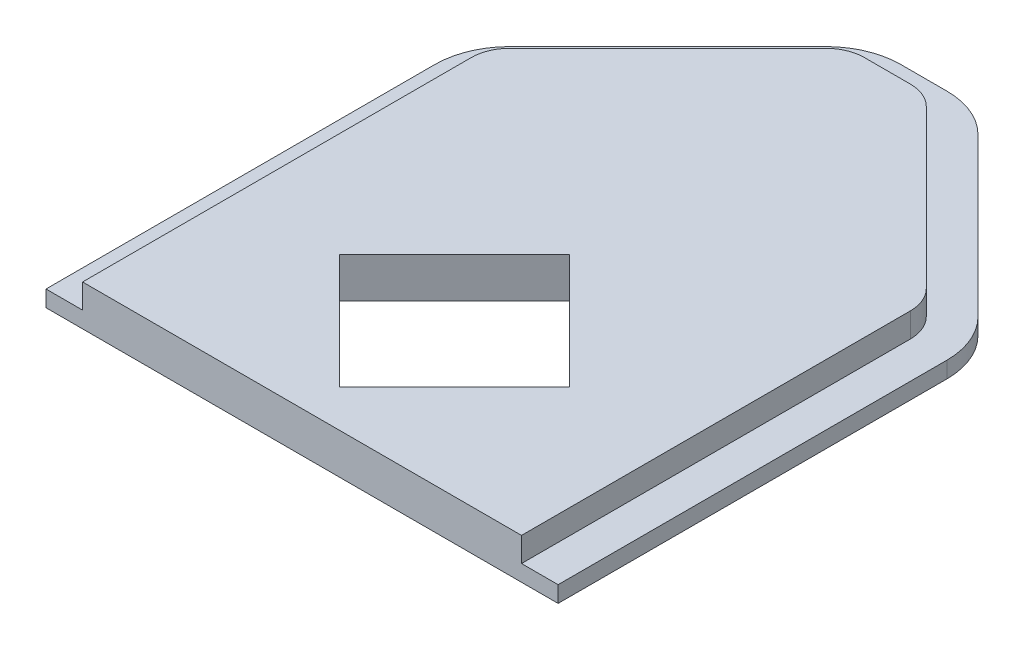
ISO-10303-21;
HEADER;
FILE_DESCRIPTION(('STEP AP214'),'2;1');
FILE_NAME('part.step','',(''),(''),'','','');
FILE_SCHEMA(('AUTOMOTIVE_DESIGN { 1 0 10303 214 1 1 1 1 }'));
ENDSEC;
DATA;
#1=APPLICATION_CONTEXT('core data for automotive mechanical design processes');
#2=APPLICATION_PROTOCOL_DEFINITION('international standard','automotive_design',2000,#1);
#3=PRODUCT_CONTEXT('',#1,'mechanical');
#4=PRODUCT('Part','Part','',(#3));
#5=PRODUCT_RELATED_PRODUCT_CATEGORY('part','',(#4));
#6=PRODUCT_DEFINITION_FORMATION('','',#4);
#7=PRODUCT_DEFINITION_CONTEXT('part definition',#1,'design');
#8=PRODUCT_DEFINITION('design','',#6,#7);
#9=PRODUCT_DEFINITION_SHAPE('','',#8);
#10=(LENGTH_UNIT() NAMED_UNIT(*) SI_UNIT(.MILLI.,.METRE.));
#11=(NAMED_UNIT(*) PLANE_ANGLE_UNIT() SI_UNIT($,.RADIAN.));
#12=(NAMED_UNIT(*) SI_UNIT($,.STERADIAN.) SOLID_ANGLE_UNIT());
#13=UNCERTAINTY_MEASURE_WITH_UNIT(LENGTH_MEASURE(1.E-05),#10,'distance_accuracy_value','');
#14=(GEOMETRIC_REPRESENTATION_CONTEXT(3) GLOBAL_UNCERTAINTY_ASSIGNED_CONTEXT((#13)) GLOBAL_UNIT_ASSIGNED_CONTEXT((#10,
#11,#12)) REPRESENTATION_CONTEXT('',''));
#15=CARTESIAN_POINT('',(0.,0.,0.));
#16=DIRECTION('',(0.,0.,1.));
#17=DIRECTION('',(1.,0.,0.));
#18=AXIS2_PLACEMENT_3D('',#15,#16,#17);
#19=CARTESIAN_POINT('',(10.8,2.,0.));
#20=DIRECTION('',(-1.,0.,0.));
#21=DIRECTION('',(0.,0.,1.));
#22=AXIS2_PLACEMENT_3D('',#19,#20,#21);
#23=PLANE('',#22);
#24=DIRECTION('',(0.,0.,1.));
#25=VECTOR('',#24,1.);
#26=CARTESIAN_POINT('',(10.8,0.8,0.));
#27=LINE('',#26,#25);
#28=CARTESIAN_POINT('',(10.8,0.8,-19.1301515190165));
#29=VERTEX_POINT('',#28);
#30=CARTESIAN_POINT('',(10.8,0.8,0.));
#31=VERTEX_POINT('',#30);
#32=EDGE_CURVE('E327',#29,#31,#27,.T.);
#33=ORIENTED_EDGE('',*,*,#32,.F.);
#34=DIRECTION('',(0.,-1.,0.));
#35=VECTOR('',#34,1.);
#36=CARTESIAN_POINT('',(10.8,2.,-19.1301515190165));
#37=LINE('',#36,#35);
#38=CARTESIAN_POINT('',(10.8,2.,-19.1301515190165));
#39=VERTEX_POINT('',#38);
#40=EDGE_CURVE('E359',#29,#39,#37,.F.);
#41=ORIENTED_EDGE('',*,*,#40,.T.);
#42=DIRECTION('',(0.,0.,-1.));
#43=VECTOR('',#42,1.);
#44=CARTESIAN_POINT('',(10.8,2.,0.));
#45=LINE('',#44,#43);
#46=CARTESIAN_POINT('',(10.8,2.,0.));
#47=VERTEX_POINT('',#46);
#48=EDGE_CURVE('E333',#47,#39,#45,.T.);
#49=ORIENTED_EDGE('',*,*,#48,.F.);
#50=DIRECTION('',(0.,-1.,0.));
#51=VECTOR('',#50,1.);
#52=CARTESIAN_POINT('',(10.8,2.,0.));
#53=LINE('',#52,#51);
#54=EDGE_CURVE('E351',#47,#31,#53,.T.);
#55=ORIENTED_EDGE('',*,*,#54,.T.);
#56=EDGE_LOOP('',(#33,#41,#49,#55));
#57=FACE_BOUND('',#56,.T.);
#58=ADVANCED_FACE('F33',(#57),#23,.F.);
#59=CARTESIAN_POINT('',(10.8,2.,-19.9171572875254));
#60=DIRECTION('',(-0.707106781186546,0.,0.707106781186549));
#61=DIRECTION('',(0.707106781186549,0.,0.707106781186546));
#62=AXIS2_PLACEMENT_3D('',#59,#60,#61);
#63=PLANE('',#62);
#64=DIRECTION('',(0.707106781186549,0.,0.707106781186546));
#65=VECTOR('',#64,1.);
#66=CARTESIAN_POINT('',(10.8,0.8,-19.9171572875254));
#67=LINE('',#66,#65);
#68=CARTESIAN_POINT('',(2.47365440327094,0.8,-28.2435028842544));
#69=VERTEX_POINT('',#68);
#70=CARTESIAN_POINT('',(10.2435028842544,0.8,-20.4736544032709));
#71=VERTEX_POINT('',#70);
#72=EDGE_CURVE('E322',#69,#71,#67,.T.);
#73=ORIENTED_EDGE('',*,*,#72,.F.);
#74=DIRECTION('',(0.,-1.,0.));
#75=VECTOR('',#74,1.);
#76=CARTESIAN_POINT('',(2.47365440327094,2.,-28.2435028842544));
#77=LINE('',#76,#75);
#78=CARTESIAN_POINT('',(2.47365440327094,2.,-28.2435028842544));
#79=VERTEX_POINT('',#78);
#80=EDGE_CURVE('E354',#69,#79,#77,.F.);
#81=ORIENTED_EDGE('',*,*,#80,.T.);
#82=DIRECTION('',(-0.707106781186549,0.,-0.707106781186546));
#83=VECTOR('',#82,1.);
#84=CARTESIAN_POINT('',(10.8,2.,-19.9171572875254));
#85=LINE('',#84,#83);
#86=CARTESIAN_POINT('',(10.2435028842544,2.,-20.4736544032709));
#87=VERTEX_POINT('',#86);
#88=EDGE_CURVE('E336',#87,#79,#85,.T.);
#89=ORIENTED_EDGE('',*,*,#88,.F.);
#90=DIRECTION('',(0.,-1.,0.));
#91=VECTOR('',#90,1.);
#92=CARTESIAN_POINT('',(10.2435028842544,2.,-20.4736544032709));
#93=LINE('',#92,#91);
#94=EDGE_CURVE('E356',#87,#71,#93,.T.);
#95=ORIENTED_EDGE('',*,*,#94,.T.);
#96=EDGE_LOOP('',(#73,#81,#89,#95));
#97=FACE_BOUND('',#96,.T.);
#98=ADVANCED_FACE('F410',(#97),#63,.F.);
#99=CARTESIAN_POINT('',(-1.91715728752538,2.,-28.8));
#100=DIRECTION('',(0.,0.,1.));
#101=DIRECTION('',(1.,0.,0.));
#102=AXIS2_PLACEMENT_3D('',#99,#100,#101);
#103=PLANE('',#102);
#104=DIRECTION('',(1.,0.,0.));
#105=VECTOR('',#104,1.);
#106=CARTESIAN_POINT('',(-1.91715728752538,0.8,-28.8));
#107=LINE('',#106,#105);
#108=CARTESIAN_POINT('',(-1.1301515190165,0.8,-28.8));
#109=VERTEX_POINT('',#108);
#110=CARTESIAN_POINT('',(1.1301515190165,0.8,-28.8));
#111=VERTEX_POINT('',#110);
#112=EDGE_CURVE('E317',#109,#111,#107,.T.);
#113=ORIENTED_EDGE('',*,*,#112,.F.);
#114=DIRECTION('',(0.,-1.,0.));
#115=VECTOR('',#114,1.);
#116=CARTESIAN_POINT('',(-1.1301515190165,2.,-28.8));
#117=LINE('',#116,#115);
#118=CARTESIAN_POINT('',(-1.1301515190165,2.,-28.8));
#119=VERTEX_POINT('',#118);
#120=EDGE_CURVE('E369',#109,#119,#117,.F.);
#121=ORIENTED_EDGE('',*,*,#120,.T.);
#122=DIRECTION('',(-1.,0.,0.));
#123=VECTOR('',#122,1.);
#124=CARTESIAN_POINT('',(-1.91715728752538,2.,-28.8));
#125=LINE('',#124,#123);
#126=CARTESIAN_POINT('',(1.1301515190165,2.,-28.8));
#127=VERTEX_POINT('',#126);
#128=EDGE_CURVE('E339',#127,#119,#125,.T.);
#129=ORIENTED_EDGE('',*,*,#128,.F.);
#130=DIRECTION('',(0.,-1.,0.));
#131=VECTOR('',#130,1.);
#132=CARTESIAN_POINT('',(1.1301515190165,2.,-28.8));
#133=LINE('',#132,#131);
#134=EDGE_CURVE('E371',#127,#111,#133,.T.);
#135=ORIENTED_EDGE('',*,*,#134,.T.);
#136=EDGE_LOOP('',(#113,#121,#129,#135));
#137=FACE_BOUND('',#136,.T.);
#138=ADVANCED_FACE('F401',(#137),#103,.F.);
#139=CARTESIAN_POINT('',(-10.8,2.,-19.9171572875254));
#140=DIRECTION('',(0.707106781186546,0.,0.707106781186549));
#141=DIRECTION('',(0.707106781186549,0.,-0.707106781186546));
#142=AXIS2_PLACEMENT_3D('',#139,#140,#141);
#143=PLANE('',#142);
#144=DIRECTION('',(0.707106781186549,0.,-0.707106781186546));
#145=VECTOR('',#144,1.);
#146=CARTESIAN_POINT('',(-10.8,0.8,-19.9171572875254));
#147=LINE('',#146,#145);
#148=CARTESIAN_POINT('',(-10.2435028842544,0.8,-20.4736544032709));
#149=VERTEX_POINT('',#148);
#150=CARTESIAN_POINT('',(-2.47365440327094,0.8,-28.2435028842544));
#151=VERTEX_POINT('',#150);
#152=EDGE_CURVE('E312',#149,#151,#147,.T.);
#153=ORIENTED_EDGE('',*,*,#152,.F.);
#154=DIRECTION('',(0.,-1.,0.));
#155=VECTOR('',#154,1.);
#156=CARTESIAN_POINT('',(-10.2435028842544,2.,-20.4736544032709));
#157=LINE('',#156,#155);
#158=CARTESIAN_POINT('',(-10.2435028842544,2.,-20.4736544032709));
#159=VERTEX_POINT('',#158);
#160=EDGE_CURVE('E374',#149,#159,#157,.F.);
#161=ORIENTED_EDGE('',*,*,#160,.T.);
#162=DIRECTION('',(-0.707106781186549,0.,0.707106781186546));
#163=VECTOR('',#162,1.);
#164=CARTESIAN_POINT('',(-10.8,2.,-19.9171572875254));
#165=LINE('',#164,#163);
#166=CARTESIAN_POINT('',(-2.47365440327094,2.,-28.2435028842544));
#167=VERTEX_POINT('',#166);
#168=EDGE_CURVE('E342',#167,#159,#165,.T.);
#169=ORIENTED_EDGE('',*,*,#168,.F.);
#170=DIRECTION('',(0.,-1.,0.));
#171=VECTOR('',#170,1.);
#172=CARTESIAN_POINT('',(-2.47365440327094,2.,-28.2435028842544));
#173=LINE('',#172,#171);
#174=EDGE_CURVE('E376',#167,#151,#173,.T.);
#175=ORIENTED_EDGE('',*,*,#174,.T.);
#176=EDGE_LOOP('',(#153,#161,#169,#175));
#177=FACE_BOUND('',#176,.T.);
#178=ADVANCED_FACE('F392',(#177),#143,.F.);
#179=CARTESIAN_POINT('',(-10.8,2.,0.));
#180=DIRECTION('',(1.,0.,0.));
#181=DIRECTION('',(0.,0.,-1.));
#182=AXIS2_PLACEMENT_3D('',#179,#180,#181);
#183=PLANE('',#182);
#184=DIRECTION('',(0.,0.,-1.));
#185=VECTOR('',#184,1.);
#186=CARTESIAN_POINT('',(-10.8,0.8,0.));
#187=LINE('',#186,#185);
#188=CARTESIAN_POINT('',(-10.8,0.8,0.));
#189=VERTEX_POINT('',#188);
#190=CARTESIAN_POINT('',(-10.8,0.8,-19.1301515190165));
#191=VERTEX_POINT('',#190);
#192=EDGE_CURVE('E291',#189,#191,#187,.T.);
#193=ORIENTED_EDGE('',*,*,#192,.F.);
#194=DIRECTION('',(0.,-1.,0.));
#195=VECTOR('',#194,1.);
#196=CARTESIAN_POINT('',(-10.8,2.,0.));
#197=LINE('',#196,#195);
#198=CARTESIAN_POINT('',(-10.8,2.,0.));
#199=VERTEX_POINT('',#198);
#200=EDGE_CURVE('E347',#199,#189,#197,.T.);
#201=ORIENTED_EDGE('',*,*,#200,.F.);
#202=DIRECTION('',(0.,0.,1.));
#203=VECTOR('',#202,1.);
#204=CARTESIAN_POINT('',(-10.8,2.,0.));
#205=LINE('',#204,#203);
#206=CARTESIAN_POINT('',(-10.8,2.,-19.1301515190165));
#207=VERTEX_POINT('',#206);
#208=EDGE_CURVE('E345',#207,#199,#205,.T.);
#209=ORIENTED_EDGE('',*,*,#208,.F.);
#210=DIRECTION('',(0.,-1.,0.));
#211=VECTOR('',#210,1.);
#212=CARTESIAN_POINT('',(-10.8,2.,-19.1301515190165));
#213=LINE('',#212,#211);
#214=EDGE_CURVE('E41',#207,#191,#213,.T.);
#215=ORIENTED_EDGE('',*,*,#214,.T.);
#216=EDGE_LOOP('',(#193,#201,#209,#215));
#217=FACE_BOUND('',#216,.T.);
#218=ADVANCED_FACE('F383',(#217),#183,.F.);
#219=CARTESIAN_POINT('',(8.9,2.,-19.1301515190165));
#220=DIRECTION('',(0.,-1.,0.));
#221=DIRECTION('',(0.,0.,-1.));
#222=AXIS2_PLACEMENT_3D('',#219,#220,#221);
#223=CYLINDRICAL_SURFACE('',#222,1.9);
#224=ORIENTED_EDGE('',*,*,#40,.F.);
#225=CARTESIAN_POINT('',(8.9,0.8,-19.1301515190165));
#226=DIRECTION('',(0.,-1.,0.));
#227=DIRECTION('',(0.,0.,-1.));
#228=AXIS2_PLACEMENT_3D('',#225,#226,#227);
#229=CIRCLE('',#228,1.9);
#230=EDGE_CURVE('E324',#29,#71,#229,.F.);
#231=ORIENTED_EDGE('',*,*,#230,.T.);
#232=ORIENTED_EDGE('',*,*,#94,.F.);
#233=CARTESIAN_POINT('',(8.9,2.,-19.1301515190165));
#234=DIRECTION('',(0.,1.,0.));
#235=DIRECTION('',(0.,0.,1.));
#236=AXIS2_PLACEMENT_3D('',#233,#234,#235);
#237=CIRCLE('',#236,1.9);
#238=EDGE_CURVE('E367',#39,#87,#237,.T.);
#239=ORIENTED_EDGE('',*,*,#238,.F.);
#240=EDGE_LOOP('',(#224,#231,#232,#239));
#241=FACE_BOUND('',#240,.T.);
#242=ADVANCED_FACE('F416',(#241),#223,.T.);
#243=CARTESIAN_POINT('',(1.1301515190165,2.,-26.9));
#244=DIRECTION('',(0.,-1.,0.));
#245=DIRECTION('',(0.,0.,-1.));
#246=AXIS2_PLACEMENT_3D('',#243,#244,#245);
#247=CYLINDRICAL_SURFACE('',#246,1.9);
#248=ORIENTED_EDGE('',*,*,#80,.F.);
#249=CARTESIAN_POINT('',(1.1301515190165,0.8,-26.9));
#250=DIRECTION('',(0.,-1.,0.));
#251=DIRECTION('',(0.,0.,-1.));
#252=AXIS2_PLACEMENT_3D('',#249,#250,#251);
#253=CIRCLE('',#252,1.9);
#254=EDGE_CURVE('E319',#69,#111,#253,.F.);
#255=ORIENTED_EDGE('',*,*,#254,.T.);
#256=ORIENTED_EDGE('',*,*,#134,.F.);
#257=CARTESIAN_POINT('',(1.1301515190165,2.,-26.9));
#258=DIRECTION('',(0.,1.,0.));
#259=DIRECTION('',(0.,0.,1.));
#260=AXIS2_PLACEMENT_3D('',#257,#258,#259);
#261=CIRCLE('',#260,1.9);
#262=EDGE_CURVE('E365',#79,#127,#261,.T.);
#263=ORIENTED_EDGE('',*,*,#262,.F.);
#264=EDGE_LOOP('',(#248,#255,#256,#263));
#265=FACE_BOUND('',#264,.T.);
#266=ADVANCED_FACE('F407',(#265),#247,.T.);
#267=CARTESIAN_POINT('',(-1.1301515190165,2.,-26.9));
#268=DIRECTION('',(0.,-1.,0.));
#269=DIRECTION('',(0.,0.,-1.));
#270=AXIS2_PLACEMENT_3D('',#267,#268,#269);
#271=CYLINDRICAL_SURFACE('',#270,1.9);
#272=ORIENTED_EDGE('',*,*,#120,.F.);
#273=CARTESIAN_POINT('',(-1.1301515190165,0.8,-26.9));
#274=DIRECTION('',(0.,-1.,0.));
#275=DIRECTION('',(0.,0.,-1.));
#276=AXIS2_PLACEMENT_3D('',#273,#274,#275);
#277=CIRCLE('',#276,1.9);
#278=EDGE_CURVE('E314',#109,#151,#277,.F.);
#279=ORIENTED_EDGE('',*,*,#278,.T.);
#280=ORIENTED_EDGE('',*,*,#174,.F.);
#281=CARTESIAN_POINT('',(-1.1301515190165,2.,-26.9));
#282=DIRECTION('',(0.,1.,0.));
#283=DIRECTION('',(0.,0.,1.));
#284=AXIS2_PLACEMENT_3D('',#281,#282,#283);
#285=CIRCLE('',#284,1.9);
#286=EDGE_CURVE('E363',#119,#167,#285,.T.);
#287=ORIENTED_EDGE('',*,*,#286,.F.);
#288=EDGE_LOOP('',(#272,#279,#280,#287));
#289=FACE_BOUND('',#288,.T.);
#290=ADVANCED_FACE('F398',(#289),#271,.T.);
#291=CARTESIAN_POINT('',(-8.9,2.,-19.1301515190165));
#292=DIRECTION('',(0.,-1.,0.));
#293=DIRECTION('',(0.,0.,-1.));
#294=AXIS2_PLACEMENT_3D('',#291,#292,#293);
#295=CYLINDRICAL_SURFACE('',#294,1.9);
#296=ORIENTED_EDGE('',*,*,#160,.F.);
#297=CARTESIAN_POINT('',(-8.9,0.8,-19.1301515190165));
#298=DIRECTION('',(0.,-1.,0.));
#299=DIRECTION('',(0.,0.,-1.));
#300=AXIS2_PLACEMENT_3D('',#297,#298,#299);
#301=CIRCLE('',#300,1.9);
#302=EDGE_CURVE('E11',#149,#191,#301,.F.);
#303=ORIENTED_EDGE('',*,*,#302,.T.);
#304=ORIENTED_EDGE('',*,*,#214,.F.);
#305=CARTESIAN_POINT('',(-8.9,2.,-19.1301515190165));
#306=DIRECTION('',(0.,1.,0.));
#307=DIRECTION('',(0.,0.,1.));
#308=AXIS2_PLACEMENT_3D('',#305,#306,#307);
#309=CIRCLE('',#308,1.9);
#310=EDGE_CURVE('E361',#159,#207,#309,.T.);
#311=ORIENTED_EDGE('',*,*,#310,.F.);
#312=EDGE_LOOP('',(#296,#303,#304,#311));
#313=FACE_BOUND('',#312,.T.);
#314=ADVANCED_FACE('F35',(#313),#295,.T.);
#315=CARTESIAN_POINT('',(-10.8,2.,0.));
#316=DIRECTION('',(0.,0.,-1.));
#317=DIRECTION('',(-1.,0.,0.));
#318=AXIS2_PLACEMENT_3D('',#315,#316,#317);
#319=PLANE('',#318);
#320=DIRECTION('',(1.,0.,0.));
#321=VECTOR('',#320,1.);
#322=CARTESIAN_POINT('',(-10.8,0.,0.));
#323=LINE('',#322,#321);
#324=CARTESIAN_POINT('',(-12.6,0.,0.));
#325=VERTEX_POINT('',#324);
#326=CARTESIAN_POINT('',(12.6,0.,0.));
#327=VERTEX_POINT('',#326);
#328=EDGE_CURVE('E329',#325,#327,#323,.T.);
#329=ORIENTED_EDGE('',*,*,#328,.T.);
#330=DIRECTION('',(0.,-1.,0.));
#331=VECTOR('',#330,1.);
#332=CARTESIAN_POINT('',(12.6,0.8,0.));
#333=LINE('',#332,#331);
#334=CARTESIAN_POINT('',(12.6,0.8,0.));
#335=VERTEX_POINT('',#334);
#336=EDGE_CURVE('E295',#335,#327,#333,.T.);
#337=ORIENTED_EDGE('',*,*,#336,.F.);
#338=DIRECTION('',(-1.,0.,0.));
#339=VECTOR('',#338,1.);
#340=CARTESIAN_POINT('',(12.6,0.8,0.));
#341=LINE('',#340,#339);
#342=EDGE_CURVE('E257',#335,#31,#341,.T.);
#343=ORIENTED_EDGE('',*,*,#342,.T.);
#344=ORIENTED_EDGE('',*,*,#54,.F.);
#345=DIRECTION('',(1.,0.,0.));
#346=VECTOR('',#345,1.);
#347=CARTESIAN_POINT('',(-10.8,2.,0.));
#348=LINE('',#347,#346);
#349=EDGE_CURVE('E330',#199,#47,#348,.T.);
#350=ORIENTED_EDGE('',*,*,#349,.F.);
#351=ORIENTED_EDGE('',*,*,#200,.T.);
#352=CARTESIAN_POINT('',(-12.6,0.8,0.));
#353=VERTEX_POINT('',#352);
#354=EDGE_CURVE('E256',#189,#353,#341,.T.);
#355=ORIENTED_EDGE('',*,*,#354,.T.);
#356=DIRECTION('',(0.,-1.,0.));
#357=VECTOR('',#356,1.);
#358=CARTESIAN_POINT('',(-12.6,0.8,0.));
#359=LINE('',#358,#357);
#360=EDGE_CURVE('E292',#353,#325,#359,.T.);
#361=ORIENTED_EDGE('',*,*,#360,.T.);
#362=EDGE_LOOP('',(#329,#337,#343,#344,#350,#351,#355,#361));
#363=FACE_BOUND('',#362,.T.);
#364=ADVANCED_FACE('F423',(#363),#319,.F.);
#365=CARTESIAN_POINT('',(0.,2.,0.));
#366=DIRECTION('',(0.,1.,0.));
#367=DIRECTION('',(0.,0.,1.));
#368=AXIS2_PLACEMENT_3D('',#365,#366,#367);
#369=PLANE('',#368);
#370=DIRECTION('',(0.707106781186548,0.,-0.707106781186547));
#371=VECTOR('',#370,1.);
#372=CARTESIAN_POINT('',(5.65685424949238,2.,-7.50000000000001));
#373=LINE('',#372,#371);
#374=CARTESIAN_POINT('',(0.,2.,-1.84314575050763));
#375=VERTEX_POINT('',#374);
#376=CARTESIAN_POINT('',(5.65685424949238,2.,-7.50000000000001));
#377=VERTEX_POINT('',#376);
#378=EDGE_CURVE('E48',#375,#377,#373,.T.);
#379=ORIENTED_EDGE('',*,*,#378,.F.);
#380=DIRECTION('',(0.707106781186547,0.,0.707106781186548));
#381=VECTOR('',#380,1.);
#382=CARTESIAN_POINT('',(0.,2.,-1.84314575050763));
#383=LINE('',#382,#381);
#384=CARTESIAN_POINT('',(-5.65685424949238,2.,-7.50000000000001));
#385=VERTEX_POINT('',#384);
#386=EDGE_CURVE('E202',#385,#375,#383,.T.);
#387=ORIENTED_EDGE('',*,*,#386,.F.);
#388=DIRECTION('',(-0.707106781186548,0.,0.707106781186548));
#389=VECTOR('',#388,1.);
#390=CARTESIAN_POINT('',(0.,2.,-13.1568542494924));
#391=LINE('',#390,#389);
#392=CARTESIAN_POINT('',(0.,2.,-13.1568542494924));
#393=VERTEX_POINT('',#392);
#394=EDGE_CURVE('E222',#393,#385,#391,.T.);
#395=ORIENTED_EDGE('',*,*,#394,.F.);
#396=DIRECTION('',(-0.707106781186547,0.,-0.707106781186548));
#397=VECTOR('',#396,1.);
#398=CARTESIAN_POINT('',(5.65685424949238,2.,-7.50000000000001));
#399=LINE('',#398,#397);
#400=EDGE_CURVE('E216',#377,#393,#399,.T.);
#401=ORIENTED_EDGE('',*,*,#400,.F.);
#402=EDGE_LOOP('',(#379,#387,#395,#401));
#403=FACE_BOUND('',#402,.T.);
#404=ORIENTED_EDGE('',*,*,#48,.T.);
#405=ORIENTED_EDGE('',*,*,#238,.T.);
#406=ORIENTED_EDGE('',*,*,#88,.T.);
#407=ORIENTED_EDGE('',*,*,#262,.T.);
#408=ORIENTED_EDGE('',*,*,#128,.T.);
#409=ORIENTED_EDGE('',*,*,#286,.T.);
#410=ORIENTED_EDGE('',*,*,#168,.T.);
#411=ORIENTED_EDGE('',*,*,#310,.T.);
#412=ORIENTED_EDGE('',*,*,#208,.T.);
#413=ORIENTED_EDGE('',*,*,#349,.T.);
#414=EDGE_LOOP('',(#404,#405,#406,#407,#408,#409,#410,#411,#412,#413));
#415=FACE_BOUND('',#414,.T.);
#416=ADVANCED_FACE('F462',(#403,#415),#369,.T.);
#417=CARTESIAN_POINT('',(0.,0.,0.));
#418=DIRECTION('',(0.,1.,0.));
#419=DIRECTION('',(0.,0.,1.));
#420=AXIS2_PLACEMENT_3D('',#417,#418,#419);
#421=PLANE('',#420);
#422=DIRECTION('',(-0.707106781186547,0.,-0.707106781186548));
#423=VECTOR('',#422,1.);
#424=CARTESIAN_POINT('',(0.,0.,-1.84314575050763));
#425=LINE('',#424,#423);
#426=CARTESIAN_POINT('',(0.,0.,-1.84314575050763));
#427=VERTEX_POINT('',#426);
#428=CARTESIAN_POINT('',(-5.65685424949238,0.,-7.50000000000001));
#429=VERTEX_POINT('',#428);
#430=EDGE_CURVE('E214',#427,#429,#425,.T.);
#431=ORIENTED_EDGE('',*,*,#430,.F.);
#432=DIRECTION('',(-0.707106781186548,0.,0.707106781186547));
#433=VECTOR('',#432,1.);
#434=CARTESIAN_POINT('',(5.65685424949238,0.,-7.50000000000001));
#435=LINE('',#434,#433);
#436=CARTESIAN_POINT('',(5.65685424949238,0.,-7.50000000000001));
#437=VERTEX_POINT('',#436);
#438=EDGE_CURVE('E196',#437,#427,#435,.T.);
#439=ORIENTED_EDGE('',*,*,#438,.F.);
#440=DIRECTION('',(0.707106781186547,0.,0.707106781186548));
#441=VECTOR('',#440,1.);
#442=CARTESIAN_POINT('',(5.65685424949238,0.,-7.50000000000001));
#443=LINE('',#442,#441);
#444=CARTESIAN_POINT('',(0.,0.,-13.1568542494924));
#445=VERTEX_POINT('',#444);
#446=EDGE_CURVE('E205',#445,#437,#443,.T.);
#447=ORIENTED_EDGE('',*,*,#446,.F.);
#448=DIRECTION('',(0.707106781186548,0.,-0.707106781186548));
#449=VECTOR('',#448,1.);
#450=CARTESIAN_POINT('',(0.,0.,-13.1568542494924));
#451=LINE('',#450,#449);
#452=EDGE_CURVE('E56',#429,#445,#451,.T.);
#453=ORIENTED_EDGE('',*,*,#452,.F.);
#454=EDGE_LOOP('',(#431,#439,#447,#453));
#455=FACE_BOUND('',#454,.T.);
#456=ORIENTED_EDGE('',*,*,#328,.F.);
#457=DIRECTION('',(0.,0.,-1.));
#458=VECTOR('',#457,1.);
#459=CARTESIAN_POINT('',(-12.6,0.,-19.1301515190165));
#460=LINE('',#459,#458);
#461=CARTESIAN_POINT('',(-12.6,0.,-19.1301515190165));
#462=VERTEX_POINT('',#461);
#463=EDGE_CURVE('E235',#325,#462,#460,.T.);
#464=ORIENTED_EDGE('',*,*,#463,.T.);
#465=CARTESIAN_POINT('',(-8.9,0.,-19.1301515190165));
#466=DIRECTION('',(0.,-1.,0.));
#467=DIRECTION('',(0.,0.,-1.));
#468=AXIS2_PLACEMENT_3D('',#465,#466,#467);
#469=CIRCLE('',#468,3.7);
#470=CARTESIAN_POINT('',(-11.5162950903902,0.,-21.7464466094067));
#471=VERTEX_POINT('',#470);
#472=EDGE_CURVE('E208',#462,#471,#469,.T.);
#473=ORIENTED_EDGE('',*,*,#472,.T.);
#474=DIRECTION('',(0.707106781186549,0.,-0.707106781186547));
#475=VECTOR('',#474,1.);
#476=CARTESIAN_POINT('',(-3.74644660940672,0.,-29.5162950903902));
#477=LINE('',#476,#475);
#478=CARTESIAN_POINT('',(-3.74644660940672,0.,-29.5162950903902));
#479=VERTEX_POINT('',#478);
#480=EDGE_CURVE('E266',#471,#479,#477,.T.);
#481=ORIENTED_EDGE('',*,*,#480,.T.);
#482=CARTESIAN_POINT('',(-1.1301515190165,0.,-26.9));
#483=DIRECTION('',(0.,-1.,0.));
#484=DIRECTION('',(0.,0.,-1.));
#485=AXIS2_PLACEMENT_3D('',#482,#483,#484);
#486=CIRCLE('',#485,3.7);
#487=CARTESIAN_POINT('',(-1.1301515190165,0.,-30.6));
#488=VERTEX_POINT('',#487);
#489=EDGE_CURVE('E269',#479,#488,#486,.T.);
#490=ORIENTED_EDGE('',*,*,#489,.T.);
#491=DIRECTION('',(1.,0.,0.));
#492=VECTOR('',#491,1.);
#493=CARTESIAN_POINT('',(1.1301515190165,0.,-30.6));
#494=LINE('',#493,#492);
#495=CARTESIAN_POINT('',(1.1301515190165,0.,-30.6));
#496=VERTEX_POINT('',#495);
#497=EDGE_CURVE('E272',#488,#496,#494,.T.);
#498=ORIENTED_EDGE('',*,*,#497,.T.);
#499=CARTESIAN_POINT('',(1.1301515190165,0.,-26.9));
#500=DIRECTION('',(0.,-1.,0.));
#501=DIRECTION('',(0.,0.,-1.));
#502=AXIS2_PLACEMENT_3D('',#499,#500,#501);
#503=CIRCLE('',#502,3.7);
#504=CARTESIAN_POINT('',(3.74644660940672,0.,-29.5162950903902));
#505=VERTEX_POINT('',#504);
#506=EDGE_CURVE('E275',#496,#505,#503,.T.);
#507=ORIENTED_EDGE('',*,*,#506,.T.);
#508=DIRECTION('',(0.707106781186549,0.,0.707106781186546));
#509=VECTOR('',#508,1.);
#510=CARTESIAN_POINT('',(11.5162950903902,0.,-21.7464466094067));
#511=LINE('',#510,#509);
#512=CARTESIAN_POINT('',(11.5162950903902,0.,-21.7464466094067));
#513=VERTEX_POINT('',#512);
#514=EDGE_CURVE('E278',#505,#513,#511,.T.);
#515=ORIENTED_EDGE('',*,*,#514,.T.);
#516=CARTESIAN_POINT('',(8.9,0.,-19.1301515190165));
#517=DIRECTION('',(0.,-1.,0.));
#518=DIRECTION('',(0.,0.,-1.));
#519=AXIS2_PLACEMENT_3D('',#516,#517,#518);
#520=CIRCLE('',#519,3.7);
#521=CARTESIAN_POINT('',(12.6,0.,-19.1301515190165));
#522=VERTEX_POINT('',#521);
#523=EDGE_CURVE('E281',#513,#522,#520,.T.);
#524=ORIENTED_EDGE('',*,*,#523,.T.);
#525=DIRECTION('',(0.,0.,1.));
#526=VECTOR('',#525,1.);
#527=CARTESIAN_POINT('',(12.6,0.,0.));
#528=LINE('',#527,#526);
#529=EDGE_CURVE('E284',#522,#327,#528,.T.);
#530=ORIENTED_EDGE('',*,*,#529,.T.);
#531=EDGE_LOOP('',(#456,#464,#473,#481,#490,#498,#507,#515,#524,#530));
#532=FACE_BOUND('',#531,.T.);
#533=ADVANCED_FACE('F211',(#455,#532),#421,.F.);
#534=CARTESIAN_POINT('',(-8.9,0.8,-19.1301515190165));
#535=DIRECTION('',(0.,-1.,0.));
#536=DIRECTION('',(0.,0.,-1.));
#537=AXIS2_PLACEMENT_3D('',#534,#535,#536);
#538=PLANE('',#537);
#539=ORIENTED_EDGE('',*,*,#230,.F.);
#540=ORIENTED_EDGE('',*,*,#32,.T.);
#541=ORIENTED_EDGE('',*,*,#342,.F.);
#542=DIRECTION('',(0.,0.,1.));
#543=VECTOR('',#542,1.);
#544=CARTESIAN_POINT('',(12.6,0.8,0.));
#545=LINE('',#544,#543);
#546=CARTESIAN_POINT('',(12.6,0.8,-19.1301515190165));
#547=VERTEX_POINT('',#546);
#548=EDGE_CURVE('E253',#547,#335,#545,.T.);
#549=ORIENTED_EDGE('',*,*,#548,.F.);
#550=CARTESIAN_POINT('',(8.9,0.8,-19.1301515190165));
#551=DIRECTION('',(0.,-1.,0.));
#552=DIRECTION('',(0.,0.,-1.));
#553=AXIS2_PLACEMENT_3D('',#550,#551,#552);
#554=CIRCLE('',#553,3.7);
#555=CARTESIAN_POINT('',(11.5162950903902,0.8,-21.7464466094067));
#556=VERTEX_POINT('',#555);
#557=EDGE_CURVE('E250',#556,#547,#554,.T.);
#558=ORIENTED_EDGE('',*,*,#557,.F.);
#559=DIRECTION('',(0.707106781186549,0.,0.707106781186546));
#560=VECTOR('',#559,1.);
#561=CARTESIAN_POINT('',(11.5162950903902,0.8,-21.7464466094067));
#562=LINE('',#561,#560);
#563=CARTESIAN_POINT('',(3.74644660940672,0.8,-29.5162950903902));
#564=VERTEX_POINT('',#563);
#565=EDGE_CURVE('E247',#564,#556,#562,.T.);
#566=ORIENTED_EDGE('',*,*,#565,.F.);
#567=CARTESIAN_POINT('',(1.1301515190165,0.8,-26.9));
#568=DIRECTION('',(0.,-1.,0.));
#569=DIRECTION('',(0.,0.,-1.));
#570=AXIS2_PLACEMENT_3D('',#567,#568,#569);
#571=CIRCLE('',#570,3.7);
#572=CARTESIAN_POINT('',(1.1301515190165,0.8,-30.6));
#573=VERTEX_POINT('',#572);
#574=EDGE_CURVE('E244',#573,#564,#571,.T.);
#575=ORIENTED_EDGE('',*,*,#574,.F.);
#576=DIRECTION('',(1.,0.,0.));
#577=VECTOR('',#576,1.);
#578=CARTESIAN_POINT('',(1.1301515190165,0.8,-30.6));
#579=LINE('',#578,#577);
#580=CARTESIAN_POINT('',(-1.1301515190165,0.8,-30.6));
#581=VERTEX_POINT('',#580);
#582=EDGE_CURVE('E241',#581,#573,#579,.T.);
#583=ORIENTED_EDGE('',*,*,#582,.F.);
#584=CARTESIAN_POINT('',(-1.1301515190165,0.8,-26.9));
#585=DIRECTION('',(0.,-1.,0.));
#586=DIRECTION('',(0.,0.,-1.));
#587=AXIS2_PLACEMENT_3D('',#584,#585,#586);
#588=CIRCLE('',#587,3.7);
#589=CARTESIAN_POINT('',(-3.74644660940672,0.8,-29.5162950903902));
#590=VERTEX_POINT('',#589);
#591=EDGE_CURVE('E238',#590,#581,#588,.T.);
#592=ORIENTED_EDGE('',*,*,#591,.F.);
#593=DIRECTION('',(0.707106781186549,0.,-0.707106781186547));
#594=VECTOR('',#593,1.);
#595=CARTESIAN_POINT('',(-3.74644660940672,0.8,-29.5162950903902));
#596=LINE('',#595,#594);
#597=CARTESIAN_POINT('',(-11.5162950903902,0.8,-21.7464466094067));
#598=VERTEX_POINT('',#597);
#599=EDGE_CURVE('E234',#598,#590,#596,.T.);
#600=ORIENTED_EDGE('',*,*,#599,.F.);
#601=CARTESIAN_POINT('',(-8.9,0.8,-19.1301515190165));
#602=DIRECTION('',(0.,-1.,0.));
#603=DIRECTION('',(0.,0.,-1.));
#604=AXIS2_PLACEMENT_3D('',#601,#602,#603);
#605=CIRCLE('',#604,3.7);
#606=CARTESIAN_POINT('',(-12.6,0.8,-19.1301515190165));
#607=VERTEX_POINT('',#606);
#608=EDGE_CURVE('E231',#607,#598,#605,.T.);
#609=ORIENTED_EDGE('',*,*,#608,.F.);
#610=DIRECTION('',(0.,0.,-1.));
#611=VECTOR('',#610,1.);
#612=CARTESIAN_POINT('',(-12.6,0.8,-19.1301515190165));
#613=LINE('',#612,#611);
#614=EDGE_CURVE('E260',#353,#607,#613,.T.);
#615=ORIENTED_EDGE('',*,*,#614,.F.);
#616=ORIENTED_EDGE('',*,*,#354,.F.);
#617=ORIENTED_EDGE('',*,*,#192,.T.);
#618=ORIENTED_EDGE('',*,*,#302,.F.);
#619=ORIENTED_EDGE('',*,*,#152,.T.);
#620=ORIENTED_EDGE('',*,*,#278,.F.);
#621=ORIENTED_EDGE('',*,*,#112,.T.);
#622=ORIENTED_EDGE('',*,*,#254,.F.);
#623=ORIENTED_EDGE('',*,*,#72,.T.);
#624=EDGE_LOOP('',(#539,#540,#541,#549,#558,#566,#575,#583,#592,#600,#609,#615,#616,#617,#618,
#619,#620,#621,#622,#623));
#625=FACE_BOUND('',#624,.T.);
#626=ADVANCED_FACE('F390',(#625),#538,.F.);
#627=CARTESIAN_POINT('',(-8.9,0.8,-19.1301515190165));
#628=DIRECTION('',(0.,-1.,0.));
#629=DIRECTION('',(0.,0.,-1.));
#630=AXIS2_PLACEMENT_3D('',#627,#628,#629);
#631=CYLINDRICAL_SURFACE('',#630,3.7);
#632=ORIENTED_EDGE('',*,*,#472,.F.);
#633=DIRECTION('',(0.,-1.,0.));
#634=VECTOR('',#633,1.);
#635=CARTESIAN_POINT('',(-12.6,0.8,-19.1301515190165));
#636=LINE('',#635,#634);
#637=EDGE_CURVE('E289',#607,#462,#636,.T.);
#638=ORIENTED_EDGE('',*,*,#637,.F.);
#639=ORIENTED_EDGE('',*,*,#608,.T.);
#640=DIRECTION('',(0.,-1.,0.));
#641=VECTOR('',#640,1.);
#642=CARTESIAN_POINT('',(-11.5162950903902,0.8,-21.7464466094067));
#643=LINE('',#642,#641);
#644=EDGE_CURVE('E263',#598,#471,#643,.T.);
#645=ORIENTED_EDGE('',*,*,#644,.T.);
#646=EDGE_LOOP('',(#632,#638,#639,#645));
#647=FACE_BOUND('',#646,.T.);
#648=ADVANCED_FACE('F455',(#647),#631,.T.);
#649=CARTESIAN_POINT('',(-12.6,0.8,-19.1301515190165));
#650=DIRECTION('',(-1.,0.,0.));
#651=DIRECTION('',(0.,0.,1.));
#652=AXIS2_PLACEMENT_3D('',#649,#650,#651);
#653=PLANE('',#652);
#654=ORIENTED_EDGE('',*,*,#463,.F.);
#655=ORIENTED_EDGE('',*,*,#360,.F.);
#656=ORIENTED_EDGE('',*,*,#614,.T.);
#657=ORIENTED_EDGE('',*,*,#637,.T.);
#658=EDGE_LOOP('',(#654,#655,#656,#657));
#659=FACE_BOUND('',#658,.T.);
#660=ADVANCED_FACE('F460',(#659),#653,.T.);
#661=CARTESIAN_POINT('',(12.6,0.8,0.));
#662=DIRECTION('',(1.,0.,0.));
#663=DIRECTION('',(0.,0.,-1.));
#664=AXIS2_PLACEMENT_3D('',#661,#662,#663);
#665=PLANE('',#664);
#666=ORIENTED_EDGE('',*,*,#529,.F.);
#667=DIRECTION('',(0.,-1.,0.));
#668=VECTOR('',#667,1.);
#669=CARTESIAN_POINT('',(12.6,0.8,-19.1301515190165));
#670=LINE('',#669,#668);
#671=EDGE_CURVE('E298',#547,#522,#670,.T.);
#672=ORIENTED_EDGE('',*,*,#671,.F.);
#673=ORIENTED_EDGE('',*,*,#548,.T.);
#674=ORIENTED_EDGE('',*,*,#336,.T.);
#675=EDGE_LOOP('',(#666,#672,#673,#674));
#676=FACE_BOUND('',#675,.T.);
#677=ADVANCED_FACE('F428',(#676),#665,.T.);
#678=CARTESIAN_POINT('',(8.9,0.8,-19.1301515190165));
#679=DIRECTION('',(0.,-1.,0.));
#680=DIRECTION('',(0.,0.,-1.));
#681=AXIS2_PLACEMENT_3D('',#678,#679,#680);
#682=CYLINDRICAL_SURFACE('',#681,3.7);
#683=ORIENTED_EDGE('',*,*,#523,.F.);
#684=DIRECTION('',(0.,-1.,0.));
#685=VECTOR('',#684,1.);
#686=CARTESIAN_POINT('',(11.5162950903902,0.8,-21.7464466094067));
#687=LINE('',#686,#685);
#688=EDGE_CURVE('E300',#556,#513,#687,.T.);
#689=ORIENTED_EDGE('',*,*,#688,.F.);
#690=ORIENTED_EDGE('',*,*,#557,.T.);
#691=ORIENTED_EDGE('',*,*,#671,.T.);
#692=EDGE_LOOP('',(#683,#689,#690,#691));
#693=FACE_BOUND('',#692,.T.);
#694=ADVANCED_FACE('F431',(#693),#682,.T.);
#695=CARTESIAN_POINT('',(11.5162950903902,0.8,-21.7464466094067));
#696=DIRECTION('',(0.707106781186546,0.,-0.707106781186549));
#697=DIRECTION('',(-0.707106781186549,0.,-0.707106781186546));
#698=AXIS2_PLACEMENT_3D('',#695,#696,#697);
#699=PLANE('',#698);
#700=ORIENTED_EDGE('',*,*,#514,.F.);
#701=DIRECTION('',(0.,-1.,0.));
#702=VECTOR('',#701,1.);
#703=CARTESIAN_POINT('',(3.74644660940672,0.8,-29.5162950903902));
#704=LINE('',#703,#702);
#705=EDGE_CURVE('E302',#564,#505,#704,.T.);
#706=ORIENTED_EDGE('',*,*,#705,.F.);
#707=ORIENTED_EDGE('',*,*,#565,.T.);
#708=ORIENTED_EDGE('',*,*,#688,.T.);
#709=EDGE_LOOP('',(#700,#706,#707,#708));
#710=FACE_BOUND('',#709,.T.);
#711=ADVANCED_FACE('F436',(#710),#699,.T.);
#712=CARTESIAN_POINT('',(1.1301515190165,0.8,-26.9));
#713=DIRECTION('',(0.,-1.,0.));
#714=DIRECTION('',(0.,0.,-1.));
#715=AXIS2_PLACEMENT_3D('',#712,#713,#714);
#716=CYLINDRICAL_SURFACE('',#715,3.7);
#717=ORIENTED_EDGE('',*,*,#506,.F.);
#718=DIRECTION('',(0.,-1.,0.));
#719=VECTOR('',#718,1.);
#720=CARTESIAN_POINT('',(1.1301515190165,0.8,-30.6));
#721=LINE('',#720,#719);
#722=EDGE_CURVE('E304',#573,#496,#721,.T.);
#723=ORIENTED_EDGE('',*,*,#722,.F.);
#724=ORIENTED_EDGE('',*,*,#574,.T.);
#725=ORIENTED_EDGE('',*,*,#705,.T.);
#726=EDGE_LOOP('',(#717,#723,#724,#725));
#727=FACE_BOUND('',#726,.T.);
#728=ADVANCED_FACE('F439',(#727),#716,.T.);
#729=CARTESIAN_POINT('',(1.1301515190165,0.8,-30.6));
#730=DIRECTION('',(0.,0.,-1.));
#731=DIRECTION('',(-1.,0.,0.));
#732=AXIS2_PLACEMENT_3D('',#729,#730,#731);
#733=PLANE('',#732);
#734=ORIENTED_EDGE('',*,*,#497,.F.);
#735=DIRECTION('',(0.,-1.,0.));
#736=VECTOR('',#735,1.);
#737=CARTESIAN_POINT('',(-1.1301515190165,0.8,-30.6));
#738=LINE('',#737,#736);
#739=EDGE_CURVE('E306',#581,#488,#738,.T.);
#740=ORIENTED_EDGE('',*,*,#739,.F.);
#741=ORIENTED_EDGE('',*,*,#582,.T.);
#742=ORIENTED_EDGE('',*,*,#722,.T.);
#743=EDGE_LOOP('',(#734,#740,#741,#742));
#744=FACE_BOUND('',#743,.T.);
#745=ADVANCED_FACE('F444',(#744),#733,.T.);
#746=CARTESIAN_POINT('',(-1.1301515190165,0.8,-26.9));
#747=DIRECTION('',(0.,-1.,0.));
#748=DIRECTION('',(0.,0.,-1.));
#749=AXIS2_PLACEMENT_3D('',#746,#747,#748);
#750=CYLINDRICAL_SURFACE('',#749,3.7);
#751=ORIENTED_EDGE('',*,*,#489,.F.);
#752=DIRECTION('',(0.,-1.,0.));
#753=VECTOR('',#752,1.);
#754=CARTESIAN_POINT('',(-3.74644660940672,0.8,-29.5162950903902));
#755=LINE('',#754,#753);
#756=EDGE_CURVE('E308',#590,#479,#755,.T.);
#757=ORIENTED_EDGE('',*,*,#756,.F.);
#758=ORIENTED_EDGE('',*,*,#591,.T.);
#759=ORIENTED_EDGE('',*,*,#739,.T.);
#760=EDGE_LOOP('',(#751,#757,#758,#759));
#761=FACE_BOUND('',#760,.T.);
#762=ADVANCED_FACE('F447',(#761),#750,.T.);
#763=CARTESIAN_POINT('',(-3.74644660940672,0.8,-29.5162950903902));
#764=DIRECTION('',(-0.707106781186546,0.,-0.707106781186548));
#765=DIRECTION('',(-0.707106781186549,0.,0.707106781186547));
#766=AXIS2_PLACEMENT_3D('',#763,#764,#765);
#767=PLANE('',#766);
#768=ORIENTED_EDGE('',*,*,#480,.F.);
#769=ORIENTED_EDGE('',*,*,#644,.F.);
#770=ORIENTED_EDGE('',*,*,#599,.T.);
#771=ORIENTED_EDGE('',*,*,#756,.T.);
#772=EDGE_LOOP('',(#768,#769,#770,#771));
#773=FACE_BOUND('',#772,.T.);
#774=ADVANCED_FACE('F452',(#773),#767,.T.);
#775=CARTESIAN_POINT('',(5.65685424949238,-0.00100000000000013,-7.50000000000001));
#776=DIRECTION('',(0.707106781186547,0.,0.707106781186548));
#777=DIRECTION('',(0.707106781186548,0.,-0.707106781186547));
#778=AXIS2_PLACEMENT_3D('',#775,#776,#777);
#779=PLANE('',#778);
#780=ORIENTED_EDGE('',*,*,#438,.T.);
#781=DIRECTION('',(0.,1.,0.));
#782=VECTOR('',#781,1.);
#783=CARTESIAN_POINT('',(0.,-0.00100000000000013,-1.84314575050763));
#784=LINE('',#783,#782);
#785=EDGE_CURVE('E209',#427,#375,#784,.T.);
#786=ORIENTED_EDGE('',*,*,#785,.T.);
#787=ORIENTED_EDGE('',*,*,#378,.T.);
#788=DIRECTION('',(0.,1.,0.));
#789=VECTOR('',#788,1.);
#790=CARTESIAN_POINT('',(5.65685424949238,-0.00100000000000013,-7.50000000000001));
#791=LINE('',#790,#789);
#792=EDGE_CURVE('E192',#437,#377,#791,.T.);
#793=ORIENTED_EDGE('',*,*,#792,.F.);
#794=EDGE_LOOP('',(#780,#786,#787,#793));
#795=FACE_BOUND('',#794,.T.);
#796=ADVANCED_FACE('F194',(#795),#779,.F.);
#797=CARTESIAN_POINT('',(0.,-0.00100000000000013,-1.84314575050763));
#798=DIRECTION('',(-0.707106781186548,0.,0.707106781186547));
#799=DIRECTION('',(0.707106781186547,0.,0.707106781186548));
#800=AXIS2_PLACEMENT_3D('',#797,#798,#799);
#801=PLANE('',#800);
#802=ORIENTED_EDGE('',*,*,#430,.T.);
#803=DIRECTION('',(0.,1.,0.));
#804=VECTOR('',#803,1.);
#805=CARTESIAN_POINT('',(-5.65685424949238,-0.00100000000000013,-7.50000000000001));
#806=LINE('',#805,#804);
#807=EDGE_CURVE('E228',#429,#385,#806,.T.);
#808=ORIENTED_EDGE('',*,*,#807,.T.);
#809=ORIENTED_EDGE('',*,*,#386,.T.);
#810=ORIENTED_EDGE('',*,*,#785,.F.);
#811=EDGE_LOOP('',(#802,#808,#809,#810));
#812=FACE_BOUND('',#811,.T.);
#813=ADVANCED_FACE('F521',(#812),#801,.F.);
#814=CARTESIAN_POINT('',(0.,-0.00100000000000013,-13.1568542494924));
#815=DIRECTION('',(-0.707106781186547,0.,-0.707106781186547));
#816=DIRECTION('',(-0.707106781186548,0.,0.707106781186548));
#817=AXIS2_PLACEMENT_3D('',#814,#815,#816);
#818=PLANE('',#817);
#819=ORIENTED_EDGE('',*,*,#452,.T.);
#820=DIRECTION('',(0.,1.,0.));
#821=VECTOR('',#820,1.);
#822=CARTESIAN_POINT('',(0.,-0.00100000000000013,-13.1568542494924));
#823=LINE('',#822,#821);
#824=EDGE_CURVE('E201',#445,#393,#823,.T.);
#825=ORIENTED_EDGE('',*,*,#824,.T.);
#826=ORIENTED_EDGE('',*,*,#394,.T.);
#827=ORIENTED_EDGE('',*,*,#807,.F.);
#828=EDGE_LOOP('',(#819,#825,#826,#827));
#829=FACE_BOUND('',#828,.T.);
#830=ADVANCED_FACE('F530',(#829),#818,.F.);
#831=CARTESIAN_POINT('',(5.65685424949238,-0.00100000000000013,-7.50000000000001));
#832=DIRECTION('',(0.707106781186548,0.,-0.707106781186547));
#833=DIRECTION('',(-0.707106781186547,0.,-0.707106781186548));
#834=AXIS2_PLACEMENT_3D('',#831,#832,#833);
#835=PLANE('',#834);
#836=ORIENTED_EDGE('',*,*,#446,.T.);
#837=ORIENTED_EDGE('',*,*,#792,.T.);
#838=ORIENTED_EDGE('',*,*,#400,.T.);
#839=ORIENTED_EDGE('',*,*,#824,.F.);
#840=EDGE_LOOP('',(#836,#837,#838,#839));
#841=FACE_BOUND('',#840,.T.);
#842=ADVANCED_FACE('F206',(#841),#835,.F.);
#843=CLOSED_SHELL('',(#58,#98,#138,#178,#218,#242,#266,#290,#314,#364,#416,#533,#626,#648,#660,
#677,#694,#711,#728,#745,#762,#774,#796,#813,#830,#842));
#844=MANIFOLD_SOLID_BREP('B2',#843);
#845=ADVANCED_BREP_SHAPE_REPRESENTATION('',(#18,#844),#14);
#846=SHAPE_DEFINITION_REPRESENTATION(#9,#845);
ENDSEC;
END-ISO-10303-21;
